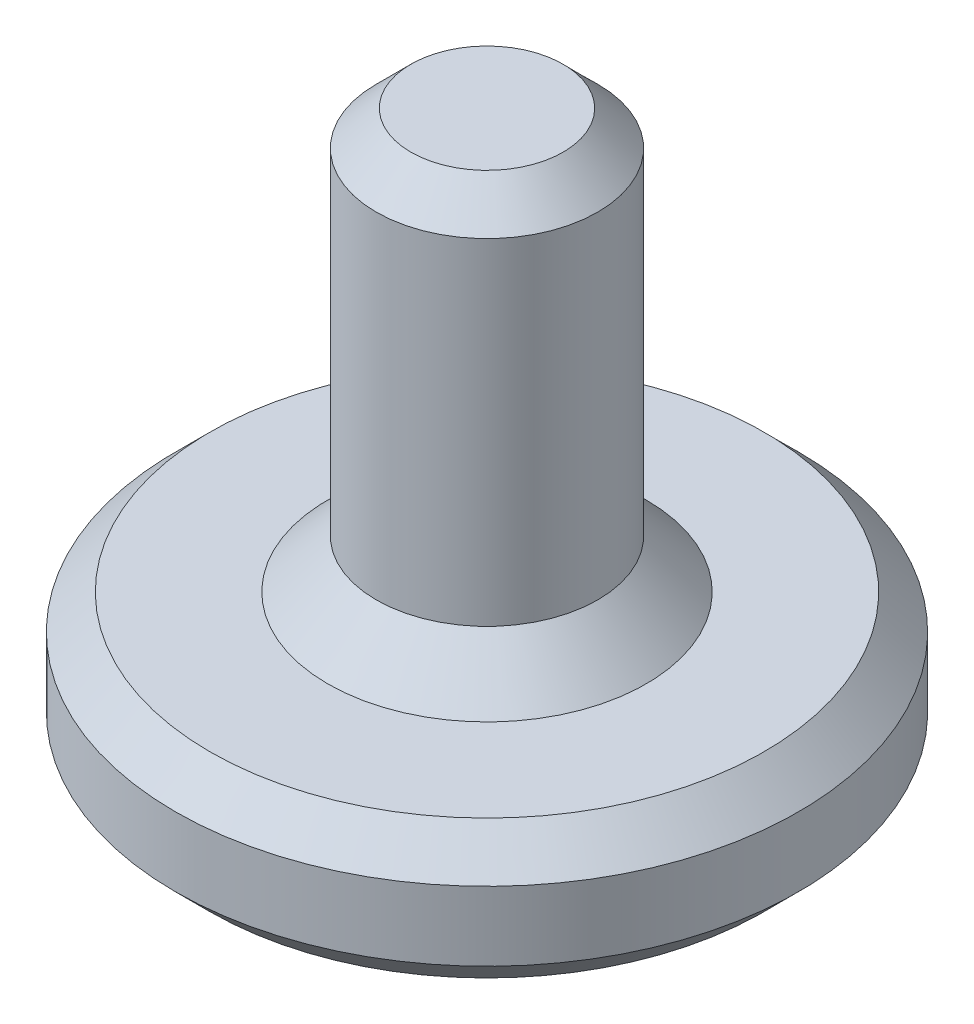
ISO-10303-21;
HEADER;
FILE_DESCRIPTION(('STEP AP214'),'2;1');
FILE_NAME('part.step','',(''),(''),'','','');
FILE_SCHEMA(('AUTOMOTIVE_DESIGN { 1 0 10303 214 1 1 1 1 }'));
ENDSEC;
DATA;
#1=APPLICATION_CONTEXT('core data for automotive mechanical design processes');
#2=APPLICATION_PROTOCOL_DEFINITION('international standard','automotive_design',2000,#1);
#3=PRODUCT_CONTEXT('',#1,'mechanical');
#4=PRODUCT('Part','Part','',(#3));
#5=PRODUCT_RELATED_PRODUCT_CATEGORY('part','',(#4));
#6=PRODUCT_DEFINITION_FORMATION('','',#4);
#7=PRODUCT_DEFINITION_CONTEXT('part definition',#1,'design');
#8=PRODUCT_DEFINITION('design','',#6,#7);
#9=PRODUCT_DEFINITION_SHAPE('','',#8);
#10=(LENGTH_UNIT() NAMED_UNIT(*) SI_UNIT(.MILLI.,.METRE.));
#11=(NAMED_UNIT(*) PLANE_ANGLE_UNIT() SI_UNIT($,.RADIAN.));
#12=(NAMED_UNIT(*) SI_UNIT($,.STERADIAN.) SOLID_ANGLE_UNIT());
#13=UNCERTAINTY_MEASURE_WITH_UNIT(LENGTH_MEASURE(1.E-05),#10,'distance_accuracy_value','');
#14=(GEOMETRIC_REPRESENTATION_CONTEXT(3) GLOBAL_UNCERTAINTY_ASSIGNED_CONTEXT((#13)) GLOBAL_UNIT_ASSIGNED_CONTEXT((#10,
#11,#12)) REPRESENTATION_CONTEXT('',''));
#15=CARTESIAN_POINT('',(0.,0.,0.));
#16=DIRECTION('',(0.,0.,1.));
#17=DIRECTION('',(1.,0.,0.));
#18=AXIS2_PLACEMENT_3D('',#15,#16,#17);
#19=CARTESIAN_POINT('',(0.,2.,0.));
#20=DIRECTION('',(0.,1.,0.));
#21=DIRECTION('',(0.,0.,1.));
#22=AXIS2_PLACEMENT_3D('',#19,#20,#21);
#23=PLANE('',#22);
#24=CARTESIAN_POINT('',(0.,2.,0.));
#25=DIRECTION('',(0.,1.,0.));
#26=DIRECTION('',(0.,0.,1.));
#27=AXIS2_PLACEMENT_3D('',#24,#25,#26);
#28=CIRCLE('',#27,4.);
#29=CARTESIAN_POINT('',(0.,2.,4.));
#30=VERTEX_POINT('',#29);
#31=EDGE_CURVE('E67',#30,#30,#28,.T.);
#32=ORIENTED_EDGE('',*,*,#31,.T.);
#33=EDGE_LOOP('',(#32));
#34=FACE_BOUND('',#33,.T.);
#35=CARTESIAN_POINT('',(0.,2.,0.));
#36=DIRECTION('',(0.,1.,0.));
#37=DIRECTION('',(0.,0.,1.));
#38=AXIS2_PLACEMENT_3D('',#35,#36,#37);
#39=CIRCLE('',#38,2.3);
#40=CARTESIAN_POINT('',(0.,2.,2.3));
#41=VERTEX_POINT('',#40);
#42=EDGE_CURVE('E70',#41,#41,#39,.F.);
#43=ORIENTED_EDGE('',*,*,#42,.T.);
#44=EDGE_LOOP('',(#43));
#45=FACE_BOUND('',#44,.T.);
#46=ADVANCED_FACE('F43',(#34,#45),#23,.T.);
#47=CARTESIAN_POINT('',(0.,0.,0.));
#48=DIRECTION('',(0.,1.,0.));
#49=DIRECTION('',(0.,0.,1.));
#50=AXIS2_PLACEMENT_3D('',#47,#48,#49);
#51=PLANE('',#50);
#52=CARTESIAN_POINT('',(0.,0.,0.));
#53=DIRECTION('',(0.,1.,0.));
#54=DIRECTION('',(0.,0.,1.));
#55=AXIS2_PLACEMENT_3D('',#52,#53,#54);
#56=CIRCLE('',#55,4.);
#57=CARTESIAN_POINT('',(0.,0.,4.));
#58=VERTEX_POINT('',#57);
#59=EDGE_CURVE('E55',#58,#58,#56,.F.);
#60=ORIENTED_EDGE('',*,*,#59,.T.);
#61=EDGE_LOOP('',(#60));
#62=FACE_BOUND('',#61,.T.);
#63=ADVANCED_FACE('F97',(#62),#51,.F.);
#64=CARTESIAN_POINT('',(0.,2.,0.));
#65=DIRECTION('',(0.,-1.,0.));
#66=DIRECTION('',(0.,0.,-1.));
#67=AXIS2_PLACEMENT_3D('',#64,#65,#66);
#68=CYLINDRICAL_SURFACE('',#67,4.5);
#69=CARTESIAN_POINT('',(0.,1.5,0.));
#70=DIRECTION('',(0.,1.,0.));
#71=DIRECTION('',(0.,0.,1.));
#72=AXIS2_PLACEMENT_3D('',#69,#70,#71);
#73=CIRCLE('',#72,4.5);
#74=CARTESIAN_POINT('',(0.,1.5,4.5));
#75=VERTEX_POINT('',#74);
#76=EDGE_CURVE('E59',#75,#75,#73,.F.);
#77=ORIENTED_EDGE('',*,*,#76,.T.);
#78=EDGE_LOOP('',(#77));
#79=FACE_BOUND('',#78,.T.);
#80=CARTESIAN_POINT('',(0.,0.499999999999999,0.));
#81=DIRECTION('',(0.,1.,0.));
#82=DIRECTION('',(0.,0.,1.));
#83=AXIS2_PLACEMENT_3D('',#80,#81,#82);
#84=CIRCLE('',#83,4.5);
#85=CARTESIAN_POINT('',(0.,0.499999999999999,4.5));
#86=VERTEX_POINT('',#85);
#87=EDGE_CURVE('E64',#86,#86,#84,.T.);
#88=ORIENTED_EDGE('',*,*,#87,.T.);
#89=EDGE_LOOP('',(#88));
#90=FACE_BOUND('',#89,.T.);
#91=ADVANCED_FACE('F103',(#79,#90),#68,.T.);
#92=CARTESIAN_POINT('',(0.,8.05,0.));
#93=DIRECTION('',(0.,-1.,0.));
#94=DIRECTION('',(0.,0.,-1.));
#95=AXIS2_PLACEMENT_3D('',#92,#93,#94);
#96=CYLINDRICAL_SURFACE('',#95,1.6);
#97=CARTESIAN_POINT('',(0.,7.55,0.));
#98=DIRECTION('',(0.,1.,0.));
#99=DIRECTION('',(0.,0.,1.));
#100=AXIS2_PLACEMENT_3D('',#97,#98,#99);
#101=CIRCLE('',#100,1.6);
#102=CARTESIAN_POINT('',(0.,7.55,1.6));
#103=VERTEX_POINT('',#102);
#104=EDGE_CURVE('E10',#103,#103,#101,.F.);
#105=ORIENTED_EDGE('',*,*,#104,.T.);
#106=EDGE_LOOP('',(#105));
#107=FACE_BOUND('',#106,.T.);
#108=CARTESIAN_POINT('',(0.,2.7,0.));
#109=DIRECTION('',(0.,1.,0.));
#110=DIRECTION('',(0.,0.,1.));
#111=AXIS2_PLACEMENT_3D('',#108,#109,#110);
#112=CIRCLE('',#111,1.6);
#113=CARTESIAN_POINT('',(0.,2.7,1.6));
#114=VERTEX_POINT('',#113);
#115=EDGE_CURVE('E73',#114,#114,#112,.T.);
#116=ORIENTED_EDGE('',*,*,#115,.T.);
#117=EDGE_LOOP('',(#116));
#118=FACE_BOUND('',#117,.T.);
#119=ADVANCED_FACE('F77',(#107,#118),#96,.T.);
#120=CARTESIAN_POINT('',(0.,8.05,0.));
#121=DIRECTION('',(0.,1.,0.));
#122=DIRECTION('',(0.,0.,1.));
#123=AXIS2_PLACEMENT_3D('',#120,#121,#122);
#124=PLANE('',#123);
#125=CARTESIAN_POINT('',(0.,8.05,0.));
#126=DIRECTION('',(0.,1.,0.));
#127=DIRECTION('',(0.,0.,1.));
#128=AXIS2_PLACEMENT_3D('',#125,#126,#127);
#129=CIRCLE('',#128,1.1);
#130=CARTESIAN_POINT('',(0.,8.05,1.1));
#131=VERTEX_POINT('',#130);
#132=EDGE_CURVE('E51',#131,#131,#129,.T.);
#133=ORIENTED_EDGE('',*,*,#132,.T.);
#134=EDGE_LOOP('',(#133));
#135=FACE_BOUND('',#134,.T.);
#136=ADVANCED_FACE('F82',(#135),#124,.T.);
#137=CARTESIAN_POINT('',(0.,2.7,0.));
#138=DIRECTION('',(0.,-1.,0.));
#139=DIRECTION('',(0.,0.,-1.));
#140=AXIS2_PLACEMENT_3D('',#137,#138,#139);
#141=CONICAL_SURFACE('',#140,1.6,0.785398163397448);
#142=ORIENTED_EDGE('',*,*,#42,.F.);
#143=EDGE_LOOP('',(#142));
#144=FACE_BOUND('',#143,.T.);
#145=ORIENTED_EDGE('',*,*,#115,.F.);
#146=EDGE_LOOP('',(#145));
#147=FACE_BOUND('',#146,.T.);
#148=ADVANCED_FACE('F79',(#144,#147),#141,.T.);
#149=CARTESIAN_POINT('',(0.,2.,0.));
#150=DIRECTION('',(0.,-1.,0.));
#151=DIRECTION('',(0.,0.,-1.));
#152=AXIS2_PLACEMENT_3D('',#149,#150,#151);
#153=CONICAL_SURFACE('',#152,4.,0.785398163397447);
#154=ORIENTED_EDGE('',*,*,#76,.F.);
#155=EDGE_LOOP('',(#154));
#156=FACE_BOUND('',#155,.T.);
#157=ORIENTED_EDGE('',*,*,#31,.F.);
#158=EDGE_LOOP('',(#157));
#159=FACE_BOUND('',#158,.T.);
#160=ADVANCED_FACE('F81',(#156,#159),#153,.T.);
#161=CARTESIAN_POINT('',(0.,0.499999999999999,0.));
#162=DIRECTION('',(0.,1.,0.));
#163=DIRECTION('',(0.,0.,1.));
#164=AXIS2_PLACEMENT_3D('',#161,#162,#163);
#165=CONICAL_SURFACE('',#164,4.5,0.78539816339745);
#166=ORIENTED_EDGE('',*,*,#59,.F.);
#167=EDGE_LOOP('',(#166));
#168=FACE_BOUND('',#167,.T.);
#169=ORIENTED_EDGE('',*,*,#87,.F.);
#170=EDGE_LOOP('',(#169));
#171=FACE_BOUND('',#170,.T.);
#172=ADVANCED_FACE('F89',(#168,#171),#165,.T.);
#173=CARTESIAN_POINT('',(0.,8.05,0.));
#174=DIRECTION('',(0.,-1.,0.));
#175=DIRECTION('',(0.,0.,-1.));
#176=AXIS2_PLACEMENT_3D('',#173,#174,#175);
#177=CONICAL_SURFACE('',#176,1.1,0.785398163397446);
#178=ORIENTED_EDGE('',*,*,#104,.F.);
#179=EDGE_LOOP('',(#178));
#180=FACE_BOUND('',#179,.T.);
#181=ORIENTED_EDGE('',*,*,#132,.F.);
#182=EDGE_LOOP('',(#181));
#183=FACE_BOUND('',#182,.T.);
#184=ADVANCED_FACE('F46',(#180,#183),#177,.T.);
#185=CLOSED_SHELL('',(#46,#63,#91,#119,#136,#148,#160,#172,#184));
#186=MANIFOLD_SOLID_BREP('B2',#185);
#187=ADVANCED_BREP_SHAPE_REPRESENTATION('',(#18,#186),#14);
#188=SHAPE_DEFINITION_REPRESENTATION(#9,#187);
ENDSEC;
END-ISO-10303-21;
